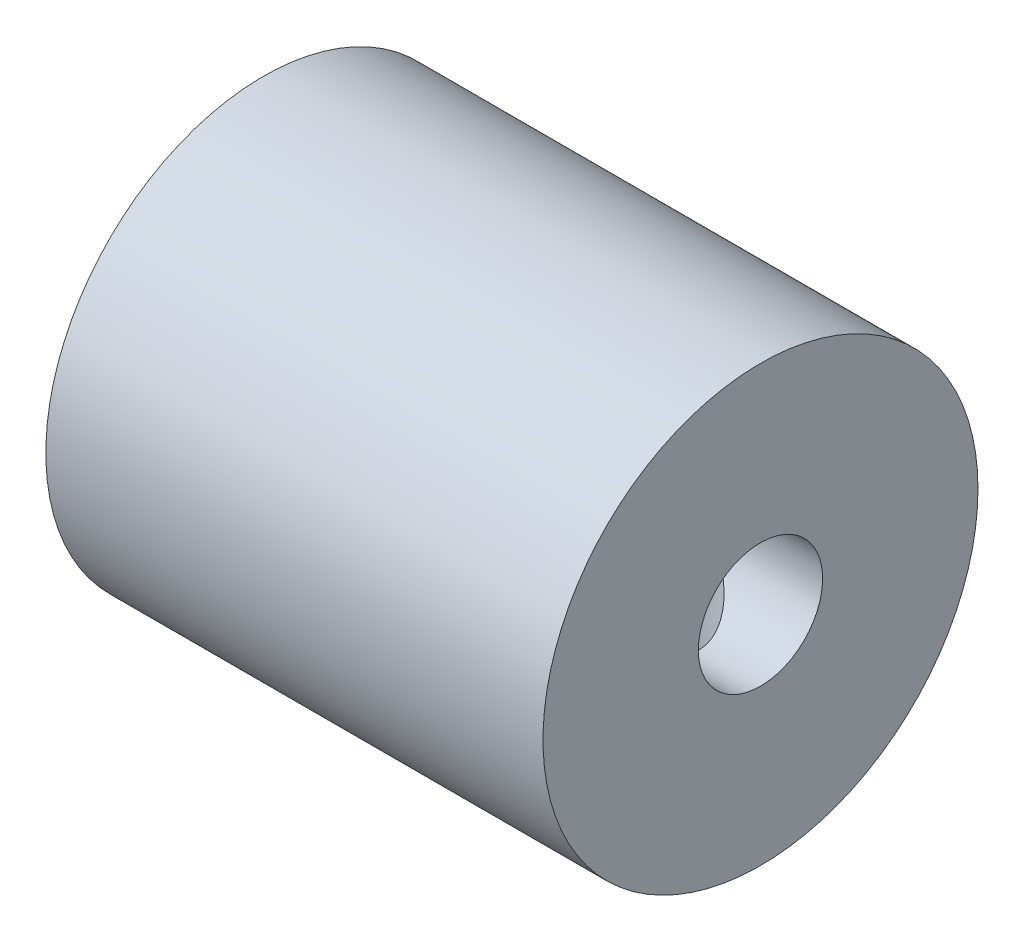
ISO-10303-21;
HEADER;
FILE_DESCRIPTION(('STEP AP214'),'2;1');
FILE_NAME('part.step','',(''),(''),'','','');
FILE_SCHEMA(('AUTOMOTIVE_DESIGN { 1 0 10303 214 1 1 1 1 }'));
ENDSEC;
DATA;
#1=APPLICATION_CONTEXT('core data for automotive mechanical design processes');
#2=APPLICATION_PROTOCOL_DEFINITION('international standard','automotive_design',2000,#1);
#3=PRODUCT_CONTEXT('',#1,'mechanical');
#4=PRODUCT('Part','Part','',(#3));
#5=PRODUCT_RELATED_PRODUCT_CATEGORY('part','',(#4));
#6=PRODUCT_DEFINITION_FORMATION('','',#4);
#7=PRODUCT_DEFINITION_CONTEXT('part definition',#1,'design');
#8=PRODUCT_DEFINITION('design','',#6,#7);
#9=PRODUCT_DEFINITION_SHAPE('','',#8);
#10=(LENGTH_UNIT() NAMED_UNIT(*) SI_UNIT(.MILLI.,.METRE.));
#11=(NAMED_UNIT(*) PLANE_ANGLE_UNIT() SI_UNIT($,.RADIAN.));
#12=(NAMED_UNIT(*) SI_UNIT($,.STERADIAN.) SOLID_ANGLE_UNIT());
#13=UNCERTAINTY_MEASURE_WITH_UNIT(LENGTH_MEASURE(1.E-05),#10,'distance_accuracy_value','');
#14=(GEOMETRIC_REPRESENTATION_CONTEXT(3) GLOBAL_UNCERTAINTY_ASSIGNED_CONTEXT((#13)) GLOBAL_UNIT_ASSIGNED_CONTEXT((#10,
#11,#12)) REPRESENTATION_CONTEXT('',''));
#15=CARTESIAN_POINT('',(0.,0.,0.));
#16=DIRECTION('',(0.,0.,1.));
#17=DIRECTION('',(1.,0.,0.));
#18=AXIS2_PLACEMENT_3D('',#15,#16,#17);
#19=CARTESIAN_POINT('',(-12.7,0.,0.));
#20=DIRECTION('',(1.,0.,0.));
#21=DIRECTION('',(0.,0.,-1.));
#22=AXIS2_PLACEMENT_3D('',#19,#20,#21);
#23=CYLINDRICAL_SURFACE('',#22,11.1125);
#24=CARTESIAN_POINT('',(-3.17499999999992,-11.1125,0.));
#25=CARTESIAN_POINT('',(-3.17500307905451,-11.1124979250477,0.17455340752389));
#26=CARTESIAN_POINT('',(-3.1894427399995,-11.1083473762574,0.349138474747732));
#27=CARTESIAN_POINT('',(-3.24669827878734,-11.0921943818785,0.693248536025236));
#28=CARTESIAN_POINT('',(-3.28952489489254,-11.0801889649601,0.862771589842036));
#29=CARTESIAN_POINT('',(-3.40202526098613,-11.0496459751665,1.1917430774214));
#30=CARTESIAN_POINT('',(-3.47166157989114,-11.0311175126882,1.35120519834659));
#31=CARTESIAN_POINT('',(-3.63565756147181,-10.9894684057751,1.65618915829276));
#32=CARTESIAN_POINT('',(-3.73001981085337,-10.9663472809398,1.80170953662038));
#33=CARTESIAN_POINT('',(-3.94340557944319,-10.9173126621811,2.07850493438863));
#34=CARTESIAN_POINT('',(-4.06295979674518,-10.8913460408799,2.20936140927979));
#35=CARTESIAN_POINT('',(-4.32220329223102,-10.8398744167858,2.44946703070496));
#36=CARTESIAN_POINT('',(-4.46189558411612,-10.8143694837296,2.55871293736111));
#37=CARTESIAN_POINT('',(-4.76090231268053,-10.7661553611468,2.75462666635215));
#38=CARTESIAN_POINT('',(-4.92055465129043,-10.743512652283,2.84079666001572));
#39=CARTESIAN_POINT('',(-5.25283431865431,-10.7043750834706,2.98489958254451));
#40=CARTESIAN_POINT('',(-5.42545884691251,-10.6878789011373,3.04283858594711));
#41=CARTESIAN_POINT('',(-5.77411018652528,-10.6634535301117,3.12735012409534));
#42=CARTESIAN_POINT('',(-5.94993628839393,-10.6553155347989,3.15468878209532));
#43=CARTESIAN_POINT('',(-6.30385319815818,-10.6479055552066,3.17961435115338));
#44=CARTESIAN_POINT('',(-6.48194350555973,-10.6486316444583,3.17720772687781));
#45=CARTESIAN_POINT('',(-6.82921642068666,-10.6586819212577,3.14331563936117));
#46=CARTESIAN_POINT('',(-6.99850065749946,-10.6677266753297,3.11277517093829));
#47=CARTESIAN_POINT('',(-7.32943546115883,-10.6929451555771,3.02500325411198));
#48=CARTESIAN_POINT('',(-7.49108533644382,-10.7091195262254,2.96776939276491));
#49=CARTESIAN_POINT('',(-7.80454091303553,-10.7470077083177,2.82750706306284));
#50=CARTESIAN_POINT('',(-7.95619610243769,-10.7687890479397,2.74416124986956));
#51=CARTESIAN_POINT('',(-8.24369154092633,-10.8154028180027,2.55426176929024));
#52=CARTESIAN_POINT('',(-8.37952825890422,-10.8402359271478,2.44770293531441));
#53=CARTESIAN_POINT('',(-8.63690864627516,-10.8913017291696,2.20964759480927));
#54=CARTESIAN_POINT('',(-8.75772073059803,-10.9175518975863,2.07736261381701));
#55=CARTESIAN_POINT('',(-8.97560753077901,-10.9676604245912,1.79408499828818));
#56=CARTESIAN_POINT('',(-9.07268101646628,-10.991518659188,1.64309139485255));
#57=CARTESIAN_POINT('',(-9.24072436645385,-11.0343398830398,1.32544037853271));
#58=CARTESIAN_POINT('',(-9.31154520530172,-11.0532747485185,1.15870008577342));
#59=CARTESIAN_POINT('',(-9.42393005262428,-11.0839131173654,0.815011752573383));
#60=CARTESIAN_POINT('',(-9.46550143542695,-11.0956184433431,0.638066297223628));
#61=CARTESIAN_POINT('',(-9.51702009106384,-11.1101961329204,0.285220391972918));
#62=CARTESIAN_POINT('',(-9.52796020390476,-11.1133457065033,0.109476138141065));
#63=CARTESIAN_POINT('',(-9.52067046474718,-11.1112630947251,-0.241342111303863));
#64=CARTESIAN_POINT('',(-9.50244411285718,-11.1060319150925,-0.416416184814413));
#65=CARTESIAN_POINT('',(-9.43814716964803,-11.0879560861276,-0.757267080570637));
#66=CARTESIAN_POINT('',(-9.39264507464919,-11.0752669816556,-0.923160161129079));
#67=CARTESIAN_POINT('',(-9.27576170309941,-11.0437294800274,-1.24493128935148));
#68=CARTESIAN_POINT('',(-9.20437743371326,-11.0248803705959,-1.40080817635737));
#69=CARTESIAN_POINT('',(-9.03601295307594,-10.98248313356,-1.70186617512808));
#70=CARTESIAN_POINT('',(-8.93851209686484,-10.9588421154555,-1.84674269738243));
#71=CARTESIAN_POINT('',(-8.72132414680271,-10.9095849101884,-2.11842116329446));
#72=CARTESIAN_POINT('',(-8.6016320060226,-10.8839682744896,-2.24521898371339));
#73=CARTESIAN_POINT('',(-8.33880516949653,-10.832601836615,-2.4814314549899));
#74=CARTESIAN_POINT('',(-8.1950317500499,-10.8068750851165,-2.59014186600883));
#75=CARTESIAN_POINT('',(-7.89072814055855,-10.7591049539238,-2.78192756425738));
#76=CARTESIAN_POINT('',(-7.73019853377629,-10.7370614460898,-2.86500374338539));
#77=CARTESIAN_POINT('',(-7.39760520257626,-10.6994110884463,-3.00255708412755));
#78=CARTESIAN_POINT('',(-7.22560822544525,-10.6837702253418,-3.05718580267886));
#79=CARTESIAN_POINT('',(-6.87433547727736,-10.6607364997541,-3.13657376982823));
#80=CARTESIAN_POINT('',(-6.69506192882487,-10.6533411380909,-3.16134206919046));
#81=CARTESIAN_POINT('',(-6.34159254769144,-10.6478657867006,-3.17973113491693));
#82=CARTESIAN_POINT('',(-6.16746051145944,-10.6494446761783,-3.17449243884472));
#83=CARTESIAN_POINT('',(-5.82267261502447,-10.6609292290021,-3.13570478644026));
#84=CARTESIAN_POINT('',(-5.65201663902118,-10.6708346144959,-3.10215677478012));
#85=CARTESIAN_POINT('',(-5.32069933578958,-10.6976382628571,-3.00840725496861));
#86=CARTESIAN_POINT('',(-5.15995382312505,-10.7144641732688,-2.94848108210965));
#87=CARTESIAN_POINT('',(-4.85067175898832,-10.7532059325021,-2.80388932016166));
#88=CARTESIAN_POINT('',(-4.70213737422728,-10.7751226820013,-2.71921935268484));
#89=CARTESIAN_POINT('',(-4.41613365913549,-10.8224902446129,-2.52422892624076));
#90=CARTESIAN_POINT('',(-4.279199291245,-10.8480346154764,-2.41314649009852));
#91=CARTESIAN_POINT('',(-4.02554456540147,-10.8992962908304,-2.1698899966022));
#92=CARTESIAN_POINT('',(-3.90882930591145,-10.9250136372451,-2.03771063553163));
#93=CARTESIAN_POINT('',(-3.69595846988154,-10.9745138582137,-1.75192423437389));
#94=CARTESIAN_POINT('',(-3.60040715770944,-10.9982301789696,-1.59785447249621));
#95=CARTESIAN_POINT('',(-3.43670606627747,-11.0402909079746,-1.27516021581411));
#96=CARTESIAN_POINT('',(-3.36854131355618,-11.0586382501906,-1.10654373578219));
#97=CARTESIAN_POINT('',(-3.26890451215966,-11.0859465975144,-0.782504650594401));
#98=CARTESIAN_POINT('',(-3.23377951051319,-11.095826239248,-0.628273774603746));
#99=CARTESIAN_POINT('',(-3.18682741912802,-11.1091034461528,-0.316036910448371));
#100=CARTESIAN_POINT('',(-3.17499721238662,-11.1125018785522,-0.158031430215552));
#101=CARTESIAN_POINT('',(-3.17499999999992,-11.1125,0.));
#102=B_SPLINE_CURVE_WITH_KNOTS('',3,(#24,#25,#26,#27,#28,#29,#30,#31,#32,#33,#34,#35,#36,#37,
#38,#39,#40,#41,#42,#43,#44,#45,#46,#47,#48,#49,#50,#51,#52,#53,#54,#55,#56,#57,#58,#59,#60,#61,
#62,#63,#64,#65,#66,#67,#68,#69,#70,#71,#72,#73,#74,#75,#76,#77,#78,#79,#80,#81,#82,#83,#84,#85,
#86,#87,#88,#89,#90,#91,#92,#93,#94,#95,#96,#97,#98,#99,#100,#101),.UNSPECIFIED.,.T.,.F.,(4,2,2,
2,2,2,2,2,2,2,2,2,2,2,2,2,2,2,2,2,2,2,2,2,2,2,2,2,2,2,2,2,2,2,2,2,2,2,4),(0.,0.523080158660984,
1.04635830192487,1.56890849047139,2.09151336750336,2.62648400805122,3.16153479124528,
3.7073375703885,4.25302285577395,4.78471721907127,5.31629602904596,5.8306459750408,
6.3450424246049,6.86595025224813,7.3869741385405,7.92763369706491,8.46832126746796,
9.01203273003334,9.55560706373221,10.0813466409592,10.6070231317753,11.1221066051126,
11.6372496581368,12.1635444648435,12.6899591131064,13.2335921650391,13.7772063000745,
14.3178938521878,14.8584174793806,15.3785360707012,15.8986373065298,16.4134339037012,
16.9283216487889,17.4603990532119,17.9926104319244,18.5384754162288,19.0840415441686,
19.5576740551799,20.0312431866175),.UNSPECIFIED.);
#103=CARTESIAN_POINT('',(-3.17499999999992,-11.1125,0.));
#104=VERTEX_POINT('',#103);
#105=EDGE_CURVE('E11',#104,#104,#102,.T.);
#106=ORIENTED_EDGE('',*,*,#105,.F.);
#107=EDGE_LOOP('',(#106));
#108=FACE_BOUND('',#107,.T.);
#109=CARTESIAN_POINT('',(9.52500000000008,-11.1125,0.));
#110=CARTESIAN_POINT('',(9.52499692094549,-11.1124979250477,0.17455340752389));
#111=CARTESIAN_POINT('',(9.5105572600005,-11.1083473762574,0.349138474747732));
#112=CARTESIAN_POINT('',(9.45330172121266,-11.0921943818785,0.693248536025236));
#113=CARTESIAN_POINT('',(9.41047510510746,-11.0801889649601,0.862771589842036));
#114=CARTESIAN_POINT('',(9.29797473901387,-11.0496459751665,1.1917430774214));
#115=CARTESIAN_POINT('',(9.22833842010886,-11.0311175126882,1.35120519834659));
#116=CARTESIAN_POINT('',(9.06434243852819,-10.9894684057751,1.65618915829276));
#117=CARTESIAN_POINT('',(8.96998018914663,-10.9663472809399,1.80170953662038));
#118=CARTESIAN_POINT('',(8.75659442055681,-10.9173126621811,2.07850493438863));
#119=CARTESIAN_POINT('',(8.63704020325482,-10.8913460408799,2.20936140927979));
#120=CARTESIAN_POINT('',(8.37779670776898,-10.8398744167858,2.44946703070496));
#121=CARTESIAN_POINT('',(8.23810441588388,-10.8143694837296,2.55871293736111));
#122=CARTESIAN_POINT('',(7.93909768731947,-10.7661553611468,2.75462666635215));
#123=CARTESIAN_POINT('',(7.77944534870957,-10.743512652283,2.84079666001572));
#124=CARTESIAN_POINT('',(7.44716568134569,-10.7043750834706,2.98489958254451));
#125=CARTESIAN_POINT('',(7.27454115308748,-10.6878789011373,3.04283858594712));
#126=CARTESIAN_POINT('',(6.92588981347472,-10.6634535301117,3.12735012409534));
#127=CARTESIAN_POINT('',(6.75006371160607,-10.6553155347989,3.15468878209532));
#128=CARTESIAN_POINT('',(6.39614680184182,-10.6479055552066,3.17961435115338));
#129=CARTESIAN_POINT('',(6.21805649444027,-10.6486316444583,3.17720772687781));
#130=CARTESIAN_POINT('',(5.87078357931334,-10.6586819212577,3.14331563936117));
#131=CARTESIAN_POINT('',(5.70149934250053,-10.6677266753297,3.11277517093829));
#132=CARTESIAN_POINT('',(5.37056453884117,-10.6929451555771,3.02500325411198));
#133=CARTESIAN_POINT('',(5.20891466355618,-10.7091195262254,2.96776939276492));
#134=CARTESIAN_POINT('',(4.89545908696446,-10.7470077083177,2.82750706306284));
#135=CARTESIAN_POINT('',(4.74380389756231,-10.7687890479397,2.74416124986956));
#136=CARTESIAN_POINT('',(4.45630845907368,-10.8154028180027,2.55426176929024));
#137=CARTESIAN_POINT('',(4.32047174109578,-10.8402359271478,2.44770293531442));
#138=CARTESIAN_POINT('',(4.06309135372484,-10.8913017291696,2.20964759480927));
#139=CARTESIAN_POINT('',(3.94227926940197,-10.9175518975863,2.07736261381702));
#140=CARTESIAN_POINT('',(3.72439246922099,-10.9676604245912,1.79408499828819));
#141=CARTESIAN_POINT('',(3.62731898353372,-10.991518659188,1.64309139485255));
#142=CARTESIAN_POINT('',(3.45927563354615,-11.0343398830398,1.32544037853271));
#143=CARTESIAN_POINT('',(3.38845479469828,-11.0532747485185,1.15870008577342));
#144=CARTESIAN_POINT('',(3.27606994737572,-11.0839131173654,0.815011752573383));
#145=CARTESIAN_POINT('',(3.23449856457305,-11.0956184433431,0.638066297223629));
#146=CARTESIAN_POINT('',(3.18297990893616,-11.1101961329204,0.285220391972919));
#147=CARTESIAN_POINT('',(3.17203979609524,-11.1133457065033,0.109476138141066));
#148=CARTESIAN_POINT('',(3.17932953525282,-11.1112630947251,-0.241342111303862));
#149=CARTESIAN_POINT('',(3.19755588714282,-11.1060319150925,-0.416416184814413));
#150=CARTESIAN_POINT('',(3.26185283035197,-11.0879560861276,-0.757267080570636));
#151=CARTESIAN_POINT('',(3.30735492535081,-11.0752669816556,-0.923160161129079));
#152=CARTESIAN_POINT('',(3.42423829690059,-11.0437294800274,-1.24493128935148));
#153=CARTESIAN_POINT('',(3.49562256628674,-11.0248803705959,-1.40080817635737));
#154=CARTESIAN_POINT('',(3.66398704692406,-10.98248313356,-1.70186617512808));
#155=CARTESIAN_POINT('',(3.76148790313515,-10.9588421154555,-1.84674269738243));
#156=CARTESIAN_POINT('',(3.97867585319728,-10.9095849101884,-2.11842116329446));
#157=CARTESIAN_POINT('',(4.09836799397739,-10.8839682744896,-2.24521898371339));
#158=CARTESIAN_POINT('',(4.36119483050347,-10.832601836615,-2.48143145498991));
#159=CARTESIAN_POINT('',(4.5049682499501,-10.8068750851165,-2.59014186600883));
#160=CARTESIAN_POINT('',(4.80927185944144,-10.7591049539238,-2.78192756425738));
#161=CARTESIAN_POINT('',(4.96980146622371,-10.7370614460898,-2.86500374338539));
#162=CARTESIAN_POINT('',(5.30239479742374,-10.6994110884463,-3.00255708412755));
#163=CARTESIAN_POINT('',(5.47439177455475,-10.6837702253418,-3.05718580267886));
#164=CARTESIAN_POINT('',(5.82566452272264,-10.6607364997541,-3.13657376982823));
#165=CARTESIAN_POINT('',(6.00493807117513,-10.6533411380909,-3.16134206919046));
#166=CARTESIAN_POINT('',(6.35840745230856,-10.6478657867006,-3.17973113491693));
#167=CARTESIAN_POINT('',(6.53253948854056,-10.6494446761783,-3.17449243884472));
#168=CARTESIAN_POINT('',(6.87732738497553,-10.6609292290021,-3.13570478644026));
#169=CARTESIAN_POINT('',(7.04798336097882,-10.6708346144959,-3.10215677478012));
#170=CARTESIAN_POINT('',(7.37930066421042,-10.6976382628571,-3.00840725496862));
#171=CARTESIAN_POINT('',(7.54004617687495,-10.7144641732688,-2.94848108210965));
#172=CARTESIAN_POINT('',(7.84932824101168,-10.7532059325021,-2.80388932016166));
#173=CARTESIAN_POINT('',(7.99786262577272,-10.7751226820013,-2.71921935268484));
#174=CARTESIAN_POINT('',(8.28386634086451,-10.8224902446129,-2.52422892624076));
#175=CARTESIAN_POINT('',(8.420800708755,-10.8480346154764,-2.41314649009852));
#176=CARTESIAN_POINT('',(8.67445543459853,-10.8992962908304,-2.1698899966022));
#177=CARTESIAN_POINT('',(8.79117069408855,-10.9250136372451,-2.03771063553163));
#178=CARTESIAN_POINT('',(9.00404153011846,-10.9745138582137,-1.75192423437389));
#179=CARTESIAN_POINT('',(9.09959284229056,-10.9982301789696,-1.59785447249621));
#180=CARTESIAN_POINT('',(9.26329393372253,-11.0402909079746,-1.27516021581411));
#181=CARTESIAN_POINT('',(9.33145868644382,-11.0586382501906,-1.10654373578219));
#182=CARTESIAN_POINT('',(9.43109548784034,-11.0859465975144,-0.7825046505944));
#183=CARTESIAN_POINT('',(9.46622048948682,-11.095826239248,-0.628273774603746));
#184=CARTESIAN_POINT('',(9.51317258087198,-11.1091034461528,-0.316036910448371));
#185=CARTESIAN_POINT('',(9.52500278761338,-11.1125018785522,-0.158031430215552));
#186=CARTESIAN_POINT('',(9.52500000000008,-11.1125,0.));
#187=B_SPLINE_CURVE_WITH_KNOTS('',3,(#109,#110,#111,#112,#113,#114,#115,#116,#117,#118,#119,
#120,#121,#122,#123,#124,#125,#126,#127,#128,#129,#130,#131,#132,#133,#134,#135,#136,#137,#138,
#139,#140,#141,#142,#143,#144,#145,#146,#147,#148,#149,#150,#151,#152,#153,#154,#155,#156,#157,
#158,#159,#160,#161,#162,#163,#164,#165,#166,#167,#168,#169,#170,#171,#172,#173,#174,#175,#176,
#177,#178,#179,#180,#181,#182,#183,#184,#185,#186),.UNSPECIFIED.,.T.,.F.,(4,2,2,2,2,2,2,2,2,2,2,
2,2,2,2,2,2,2,2,2,2,2,2,2,2,2,2,2,2,2,2,2,2,2,2,2,2,2,4),(0.,0.523080158660984,1.04635830192487,
1.5689084904714,2.09151336750336,2.62648400805122,3.16153479124528,3.7073375703885,
4.25302285577396,4.78471721907127,5.31629602904596,5.83064597504081,6.34504242460491,
6.86595025224813,7.3869741385405,7.92763369706491,8.46832126746796,9.01203273003335,
9.55560706373221,10.0813466409592,10.6070231317753,11.1221066051127,11.6372496581368,
12.1635444648435,12.6899591131064,13.2335921650391,13.7772063000745,14.3178938521878,
14.8584174793807,15.3785360707012,15.8986373065298,16.4134339037012,16.9283216487889,
17.4603990532119,17.9926104319244,18.5384754162288,19.0840415441686,19.5576740551799,
20.0312431866175),.UNSPECIFIED.);
#188=CARTESIAN_POINT('',(9.52500000000008,-11.1125,0.));
#189=VERTEX_POINT('',#188);
#190=EDGE_CURVE('E43',#189,#189,#187,.T.);
#191=ORIENTED_EDGE('',*,*,#190,.F.);
#192=EDGE_LOOP('',(#191));
#193=FACE_BOUND('',#192,.T.);
#194=CARTESIAN_POINT('',(-12.7,0.,0.));
#195=DIRECTION('',(1.,0.,0.));
#196=DIRECTION('',(0.,0.,-1.));
#197=AXIS2_PLACEMENT_3D('',#194,#195,#196);
#198=CIRCLE('',#197,11.1125);
#199=CARTESIAN_POINT('',(-12.7,0.,-11.1125));
#200=VERTEX_POINT('',#199);
#201=EDGE_CURVE('E76',#200,#200,#198,.T.);
#202=ORIENTED_EDGE('',*,*,#201,.T.);
#203=EDGE_LOOP('',(#202));
#204=FACE_BOUND('',#203,.T.);
#205=CARTESIAN_POINT('',(12.7,0.,0.));
#206=DIRECTION('',(1.,0.,0.));
#207=DIRECTION('',(0.,0.,-1.));
#208=AXIS2_PLACEMENT_3D('',#205,#206,#207);
#209=CIRCLE('',#208,11.1125);
#210=CARTESIAN_POINT('',(12.7,0.,-11.1125));
#211=VERTEX_POINT('',#210);
#212=EDGE_CURVE('E73',#211,#211,#209,.T.);
#213=ORIENTED_EDGE('',*,*,#212,.F.);
#214=EDGE_LOOP('',(#213));
#215=FACE_BOUND('',#214,.T.);
#216=ADVANCED_FACE('F32',(#108,#193,#204,#215),#23,.T.);
#217=CARTESIAN_POINT('',(-12.7,11.1125,0.));
#218=DIRECTION('',(-1.,0.,0.));
#219=DIRECTION('',(0.,0.,1.));
#220=AXIS2_PLACEMENT_3D('',#217,#218,#219);
#221=PLANE('',#220);
#222=CARTESIAN_POINT('',(-12.7,0.,0.));
#223=DIRECTION('',(-1.,0.,0.));
#224=DIRECTION('',(0.,0.,1.));
#225=AXIS2_PLACEMENT_3D('',#222,#223,#224);
#226=CIRCLE('',#225,5.55625000000001);
#227=CARTESIAN_POINT('',(-12.7,0.,5.55625000000001));
#228=VERTEX_POINT('',#227);
#229=EDGE_CURVE('E58',#228,#228,#226,.T.);
#230=ORIENTED_EDGE('',*,*,#229,.F.);
#231=EDGE_LOOP('',(#230));
#232=FACE_BOUND('',#231,.T.);
#233=ORIENTED_EDGE('',*,*,#201,.F.);
#234=EDGE_LOOP('',(#233));
#235=FACE_BOUND('',#234,.T.);
#236=ADVANCED_FACE('F106',(#232,#235),#221,.T.);
#237=CARTESIAN_POINT('',(12.7,0.,0.));
#238=DIRECTION('',(1.,0.,0.));
#239=DIRECTION('',(0.,0.,-1.));
#240=AXIS2_PLACEMENT_3D('',#237,#238,#239);
#241=PLANE('',#240);
#242=CARTESIAN_POINT('',(12.7,0.,0.));
#243=DIRECTION('',(-1.,0.,0.));
#244=DIRECTION('',(0.,0.,1.));
#245=AXIS2_PLACEMENT_3D('',#242,#243,#244);
#246=CIRCLE('',#245,3.17500000000001);
#247=CARTESIAN_POINT('',(12.7,0.,3.17500000000001));
#248=VERTEX_POINT('',#247);
#249=EDGE_CURVE('E70',#248,#248,#246,.T.);
#250=ORIENTED_EDGE('',*,*,#249,.T.);
#251=EDGE_LOOP('',(#250));
#252=FACE_BOUND('',#251,.T.);
#253=ORIENTED_EDGE('',*,*,#212,.T.);
#254=EDGE_LOOP('',(#253));
#255=FACE_BOUND('',#254,.T.);
#256=ADVANCED_FACE('F111',(#252,#255),#241,.T.);
#257=CARTESIAN_POINT('',(-12.7,0.,0.));
#258=DIRECTION('',(-1.,0.,0.));
#259=DIRECTION('',(0.,0.,1.));
#260=AXIS2_PLACEMENT_3D('',#257,#258,#259);
#261=CYLINDRICAL_SURFACE('',#260,3.17500000000001);
#262=CARTESIAN_POINT('',(6.35,0.,0.));
#263=DIRECTION('',(-0.707106781186547,-0.707106781186547,0.));
#264=DIRECTION('',(-0.707106781186547,0.707106781186547,0.));
#265=AXIS2_PLACEMENT_3D('',#262,#263,#264);
#266=ELLIPSE('',#265,4.49012806053464,3.17500000000005);
#267=CARTESIAN_POINT('',(6.35,0.,-3.17500000000006));
#268=VERTEX_POINT('',#267);
#269=CARTESIAN_POINT('',(6.35,0.,3.17500000000005));
#270=VERTEX_POINT('',#269);
#271=EDGE_CURVE('E51',#268,#270,#266,.T.);
#272=ORIENTED_EDGE('',*,*,#271,.T.);
#273=CARTESIAN_POINT('',(6.35,0.,0.));
#274=DIRECTION('',(-0.707106781186547,0.707106781186547,0.));
#275=DIRECTION('',(-0.707106781186547,-0.707106781186547,0.));
#276=AXIS2_PLACEMENT_3D('',#273,#274,#275);
#277=ELLIPSE('',#276,4.49012806053464,3.17500000000005);
#278=EDGE_CURVE('E49',#270,#268,#277,.F.);
#279=ORIENTED_EDGE('',*,*,#278,.T.);
#280=EDGE_LOOP('',(#272,#279));
#281=FACE_BOUND('',#280,.T.);
#282=ORIENTED_EDGE('',*,*,#249,.F.);
#283=EDGE_LOOP('',(#282));
#284=FACE_BOUND('',#283,.T.);
#285=CARTESIAN_POINT('',(0.,0.,0.));
#286=DIRECTION('',(-1.,0.,0.));
#287=DIRECTION('',(0.,0.,1.));
#288=AXIS2_PLACEMENT_3D('',#285,#286,#287);
#289=CIRCLE('',#288,3.17500000000001);
#290=CARTESIAN_POINT('',(0.,0.,3.17500000000001));
#291=VERTEX_POINT('',#290);
#292=EDGE_CURVE('E67',#291,#291,#289,.T.);
#293=ORIENTED_EDGE('',*,*,#292,.T.);
#294=EDGE_LOOP('',(#293));
#295=FACE_BOUND('',#294,.T.);
#296=ADVANCED_FACE('F56',(#281,#284,#295),#261,.F.);
#297=CARTESIAN_POINT('',(0.,3.17500000000001,0.));
#298=DIRECTION('',(1.,0.,0.));
#299=DIRECTION('',(0.,0.,-1.));
#300=AXIS2_PLACEMENT_3D('',#297,#298,#299);
#301=PLANE('',#300);
#302=ORIENTED_EDGE('',*,*,#292,.F.);
#303=EDGE_LOOP('',(#302));
#304=FACE_BOUND('',#303,.T.);
#305=CARTESIAN_POINT('',(0.,0.,0.));
#306=DIRECTION('',(-1.,0.,0.));
#307=DIRECTION('',(0.,0.,1.));
#308=AXIS2_PLACEMENT_3D('',#305,#306,#307);
#309=CIRCLE('',#308,5.55625000000001);
#310=CARTESIAN_POINT('',(0.,0.,5.55625000000001));
#311=VERTEX_POINT('',#310);
#312=EDGE_CURVE('E61',#311,#311,#309,.T.);
#313=ORIENTED_EDGE('',*,*,#312,.T.);
#314=EDGE_LOOP('',(#313));
#315=FACE_BOUND('',#314,.T.);
#316=ADVANCED_FACE('F92',(#304,#315),#301,.F.);
#317=CARTESIAN_POINT('',(-12.7,0.,0.));
#318=DIRECTION('',(-1.,0.,0.));
#319=DIRECTION('',(0.,0.,1.));
#320=AXIS2_PLACEMENT_3D('',#317,#318,#319);
#321=CYLINDRICAL_SURFACE('',#320,5.55625000000001);
#322=CARTESIAN_POINT('',(-6.35,-4.55974660068958,3.17499999999998));
#323=CARTESIAN_POINT('',(-6.51154286592279,-4.5597517202516,3.17499674342566));
#324=CARTESIAN_POINT('',(-6.6731090846276,-4.56846095518354,3.16259395020656));
#325=CARTESIAN_POINT('',(-6.99092865429164,-4.60184573451136,3.11380082412923));
#326=CARTESIAN_POINT('',(-7.14717615345696,-4.62653830228911,3.0773849148259));
#327=CARTESIAN_POINT('',(-7.44915092881087,-4.68803161010641,2.9828497545655));
#328=CARTESIAN_POINT('',(-7.59493931410319,-4.72475358446846,2.92487136403474));
#329=CARTESIAN_POINT('',(-7.87466017936031,-4.80603009676547,2.78930562527725));
#330=CARTESIAN_POINT('',(-8.00858884034555,-4.85058714400087,2.71171199147814));
#331=CARTESIAN_POINT('',(-8.27693911260423,-4.948443128249,2.52916317401301));
#332=CARTESIAN_POINT('',(-8.40980079159828,-5.00216476451429,2.42213937515592));
#333=CARTESIAN_POINT('',(-8.65694811352943,-5.10890106861728,2.18806713412153));
#334=CARTESIAN_POINT('',(-8.77122166266175,-5.16191525575067,2.06100576012565));
#335=CARTESIAN_POINT('',(-8.98870487029122,-5.26727147217553,1.77564491732221));
#336=CARTESIAN_POINT('',(-9.08983660982817,-5.31907265834928,1.61552552892772));
#337=CARTESIAN_POINT('',(-9.21965365709668,-5.38747372647448,1.36189985106555));
#338=CARTESIAN_POINT('',(-9.25928864339974,-5.40872940298067,1.2750862075313));
#339=CARTESIAN_POINT('',(-9.33079916266694,-5.44752642589165,1.09754222107575));
#340=CARTESIAN_POINT('',(-9.36267958226792,-5.46507011054247,1.00681438739712));
#341=CARTESIAN_POINT('',(-9.41577293224447,-5.49452553395119,0.830299116777771));
#342=CARTESIAN_POINT('',(-9.43767741657222,-5.50679687312465,0.744778860752562));
#343=CARTESIAN_POINT('',(-9.47433729057852,-5.52743545053221,0.571797488001109));
#344=CARTESIAN_POINT('',(-9.48909651173729,-5.53580478103798,0.484337437817012));
#345=CARTESIAN_POINT('',(-9.5112481953292,-5.54839567214872,0.308225859688889));
#346=CARTESIAN_POINT('',(-9.51864399173852,-5.55261910989897,0.219574889408241));
#347=CARTESIAN_POINT('',(-9.52597057534451,-5.55680437891544,0.0418940241863875));
#348=CARTESIAN_POINT('',(-9.5259020211874,-5.55676658618803,-0.0471358366286974));
#349=CARTESIAN_POINT('',(-9.51532258532583,-5.55071944551583,-0.293494448519054));
#350=CARTESIAN_POINT('',(-9.4967866354449,-5.54012003595011,-0.450459788094814));
#351=CARTESIAN_POINT('',(-9.43706506893528,-5.50642074954423,-0.75850379162526));
#352=CARTESIAN_POINT('',(-9.39587778602657,-5.48331995307757,-0.909582021636064));
#353=CARTESIAN_POINT('',(-9.29219049722171,-5.42640588645526,-1.20360044085805));
#354=CARTESIAN_POINT('',(-9.22950445541535,-5.39249929775338,-1.34645643703014));
#355=CARTESIAN_POINT('',(-9.08507571029435,-5.31678016879858,-1.61985264701346));
#356=CARTESIAN_POINT('',(-9.00332738785481,-5.27496529805279,-1.75038921336897));
#357=CARTESIAN_POINT('',(-8.81261576132229,-5.1815134782181,-2.01124941383322));
#358=CARTESIAN_POINT('',(-8.70162062496962,-5.12930055210852,-2.13988086000182));
#359=CARTESIAN_POINT('',(-8.46084375217212,-5.02346973796632,-2.37774149803149));
#360=CARTESIAN_POINT('',(-8.33103926017469,-4.96985021351758,-2.48694682650992));
#361=CARTESIAN_POINT('',(-8.04087763880675,-4.86111935285473,-2.69376868569675));
#362=CARTESIAN_POINT('',(-7.87876497195782,-4.80639169155943,-2.78914638572719));
#363=CARTESIAN_POINT('',(-7.53732692966853,-4.70898064530291,-2.9506572057846));
#364=CARTESIAN_POINT('',(-7.3580327459866,-4.66627596862,-3.01684214314632));
#365=CARTESIAN_POINT('',(-7.02959352420492,-4.6079626366375,-3.10494997383516));
#366=CARTESIAN_POINT('',(-6.88293749313028,-4.58838980561373,-3.13353559653392));
#367=CARTESIAN_POINT('',(-6.58592127995196,-4.56345699752214,-3.16974579351273));
#368=CARTESIAN_POINT('',(-6.43556478908343,-4.55808339382573,-3.17739046453716));
#369=CARTESIAN_POINT('',(-6.13542804750848,-4.56232224796338,-3.17129894127433));
#370=CARTESIAN_POINT('',(-5.98564819000808,-4.57194356704996,-3.15755010449716));
#371=CARTESIAN_POINT('',(-5.69095003046613,-4.60479372698073,-3.10943871350008));
#372=CARTESIAN_POINT('',(-5.54603535155281,-4.62803248113712,-3.0750611413957));
#373=CARTESIAN_POINT('',(-5.26263660927278,-4.68552074875748,-2.98673580137554));
#374=CARTESIAN_POINT('',(-5.12425580536131,-4.71990450815882,-2.93254834246307));
#375=CARTESIAN_POINT('',(-4.85800110095872,-4.79593932010087,-2.80647356908941));
#376=CARTESIAN_POINT('',(-4.73013151502866,-4.83759333518353,-2.7345790342786));
#377=CARTESIAN_POINT('',(-4.46603771474603,-4.93182948793081,-2.56129241280642));
#378=CARTESIAN_POINT('',(-4.33195882786458,-4.98507714043882,-2.45698344112657));
#379=CARTESIAN_POINT('',(-4.08196510784551,-5.09141055635071,-2.22831826284819));
#380=CARTESIAN_POINT('',(-3.96606546013199,-5.14449614847434,-2.10394547064421));
#381=CARTESIAN_POINT('',(-3.74413726984591,-5.25084630689629,-1.82348284339858));
#382=CARTESIAN_POINT('',(-3.64025061350734,-5.30359924741706,-1.66546590823128));
#383=CARTESIAN_POINT('',(-3.50599322700215,-5.37384714035945,-1.41466570145366));
#384=CARTESIAN_POINT('',(-3.46482603153903,-5.3957887087554,-1.32873875569635));
#385=CARTESIAN_POINT('',(-3.39014987333774,-5.43608384084733,-1.15283198672474));
#386=CARTESIAN_POINT('',(-3.35663615073263,-5.454439633585,-1.06285472441029));
#387=CARTESIAN_POINT('',(-3.30012567220687,-5.48566455368178,-0.886974069794611));
#388=CARTESIAN_POINT('',(-3.27649718781583,-5.49885753901729,-0.801330493812713));
#389=CARTESIAN_POINT('',(-3.236439228667,-5.52134717945446,-0.627915537298162));
#390=CARTESIAN_POINT('',(-3.22000588344376,-5.53064592925631,-0.540145327624722));
#391=CARTESIAN_POINT('',(-3.19458142343661,-5.54507386604891,-0.363230168747205));
#392=CARTESIAN_POINT('',(-3.18558664855551,-5.55020510361302,-0.274085917652436));
#393=CARTESIAN_POINT('',(-3.17516291423753,-5.55615579248971,-0.0952430572311848));
#394=CARTESIAN_POINT('',(-3.17373321816032,-5.55697566361629,-0.00554450273091968));
#395=CARTESIAN_POINT('',(-3.18031406139778,-5.55321044446051,0.242243823338719));
#396=CARTESIAN_POINT('',(-3.19638547956982,-5.54400937229558,0.400144796518006));
#397=CARTESIAN_POINT('',(-3.25149061352536,-5.51285318450511,0.710461641150437));
#398=CARTESIAN_POINT('',(-3.29052553311306,-5.49089740024642,0.862877224601193));
#399=CARTESIAN_POINT('',(-3.38988719131292,-5.4361601735851,1.1587728686519));
#400=CARTESIAN_POINT('',(-3.45024888296354,-5.40336096530208,1.30223780288195));
#401=CARTESIAN_POINT('',(-3.59011726353229,-5.32960747828461,1.57717961418153));
#402=CARTESIAN_POINT('',(-3.66962919206506,-5.28865096819723,1.70865319675203));
#403=CARTESIAN_POINT('',(-3.85542597395134,-5.19682168426096,1.971391306572));
#404=CARTESIAN_POINT('',(-3.96369270062181,-5.14535379848421,2.10104531150167));
#405=CARTESIAN_POINT('',(-4.19898620135394,-5.04054031996988,2.34138840663482));
#406=CARTESIAN_POINT('',(-4.32603534990119,-4.98719254635941,2.45205453313696));
#407=CARTESIAN_POINT('',(-4.61107317135416,-4.87811698495778,2.66296840776599));
#408=CARTESIAN_POINT('',(-4.77090810852402,-4.82272404515693,2.76091515355164));
#409=CARTESIAN_POINT('',(-5.10808577462719,-4.72312485044014,2.92805882197741));
#410=CARTESIAN_POINT('',(-5.2853992388677,-4.67890032388241,2.997302823249));
#411=CARTESIAN_POINT('',(-5.61066035515452,-4.61720824119809,3.09122978375375));
#412=CARTESIAN_POINT('',(-5.75598344140266,-4.59592620430688,3.12249848771895));
#413=CARTESIAN_POINT('',(-6.05086706960075,-4.56719947090191,3.16437546237178));
#414=CARTESIAN_POINT('',(-6.2004235242108,-4.55974186036236,3.1750030153415));
#415=CARTESIAN_POINT('',(-6.35,-4.55974660068958,3.17499999999998));
#416=B_SPLINE_CURVE_WITH_KNOTS('',3,(#322,#323,#324,#325,#326,#327,#328,#329,#330,#331,#332,
#333,#334,#335,#336,#337,#338,#339,#340,#341,#342,#343,#344,#345,#346,#347,#348,#349,#350,#351,
#352,#353,#354,#355,#356,#357,#358,#359,#360,#361,#362,#363,#364,#365,#366,#367,#368,#369,#370,
#371,#372,#373,#374,#375,#376,#377,#378,#379,#380,#381,#382,#383,#384,#385,#386,#387,#388,#389,
#390,#391,#392,#393,#394,#395,#396,#397,#398,#399,#400,#401,#402,#403,#404,#405,#406,#407,#408,
#409,#410,#411,#412,#413,#414,#415),.UNSPECIFIED.,.T.,.F.,(4,2,2,2,2,2,2,2,2,2,2,2,2,2,2,2,2,2,
2,2,2,2,2,2,2,2,2,2,2,2,2,2,2,2,2,2,2,2,2,2,2,2,2,2,2,2,4),(0.,0.484003151438762,
0.968522650628986,1.44993100926463,1.93149382794114,2.46592240014161,3.00069730327256,
3.58620286373008,3.87914768266849,4.17190741772628,4.43892183989416,4.7057929227961,
4.97254311806194,5.23926977559803,5.71202420370954,6.18481341329017,6.66180160505796,
7.13893058019287,7.66999608311512,8.20170951766327,8.78640157491821,9.37005158212592,
9.8201491817821,10.2698146773563,10.7197460036173,11.1700052815565,11.6259032699168,
12.0819874668096,12.6138968492161,13.1462482050937,13.7317666825626,14.0247221426279,
14.31749490789,14.586568167853,14.8554965074619,15.1242924438739,15.3930622061274,
15.8674964234632,16.3419555140441,16.8171958436797,17.2925663498053,17.8201736703618,
18.3484146425393,18.9319162946576,19.5144570557672,19.9630266079418,20.4111769193129),.UNSPECIFIED.);
#417=CARTESIAN_POINT('',(-6.35,-4.55974660068958,3.17499999999998));
#418=VERTEX_POINT('',#417);
#419=EDGE_CURVE('E54',#418,#418,#416,.T.);
#420=ORIENTED_EDGE('',*,*,#419,.T.);
#421=EDGE_LOOP('',(#420));
#422=FACE_BOUND('',#421,.T.);
#423=ORIENTED_EDGE('',*,*,#312,.F.);
#424=EDGE_LOOP('',(#423));
#425=FACE_BOUND('',#424,.T.);
#426=ORIENTED_EDGE('',*,*,#229,.T.);
#427=EDGE_LOOP('',(#426));
#428=FACE_BOUND('',#427,.T.);
#429=ADVANCED_FACE('F86',(#422,#425,#428),#321,.F.);
#430=CARTESIAN_POINT('',(6.35,0.,0.));
#431=DIRECTION('',(0.,1.,0.));
#432=DIRECTION('',(0.,0.,1.));
#433=AXIS2_PLACEMENT_3D('',#430,#431,#432);
#434=CYLINDRICAL_SURFACE('',#433,3.17500000000008);
#435=ORIENTED_EDGE('',*,*,#190,.T.);
#436=EDGE_LOOP('',(#435));
#437=FACE_BOUND('',#436,.T.);
#438=ORIENTED_EDGE('',*,*,#271,.F.);
#439=ORIENTED_EDGE('',*,*,#278,.F.);
#440=EDGE_LOOP('',(#438,#439));
#441=FACE_BOUND('',#440,.T.);
#442=ADVANCED_FACE('F52',(#437,#441),#434,.F.);
#443=CARTESIAN_POINT('',(-6.35,-4.55974660068958,0.));
#444=DIRECTION('',(0.,1.,0.));
#445=DIRECTION('',(0.,0.,1.));
#446=AXIS2_PLACEMENT_3D('',#443,#444,#445);
#447=CYLINDRICAL_SURFACE('',#446,3.17500000000008);
#448=ORIENTED_EDGE('',*,*,#105,.T.);
#449=EDGE_LOOP('',(#448));
#450=FACE_BOUND('',#449,.T.);
#451=ORIENTED_EDGE('',*,*,#419,.F.);
#452=EDGE_LOOP('',(#451));
#453=FACE_BOUND('',#452,.T.);
#454=ADVANCED_FACE('F85',(#450,#453),#447,.F.);
#455=CLOSED_SHELL('',(#216,#236,#256,#296,#316,#429,#442,#454));
#456=MANIFOLD_SOLID_BREP('B2',#455);
#457=ADVANCED_BREP_SHAPE_REPRESENTATION('',(#18,#456),#14);
#458=SHAPE_DEFINITION_REPRESENTATION(#9,#457);
ENDSEC;
END-ISO-10303-21;
